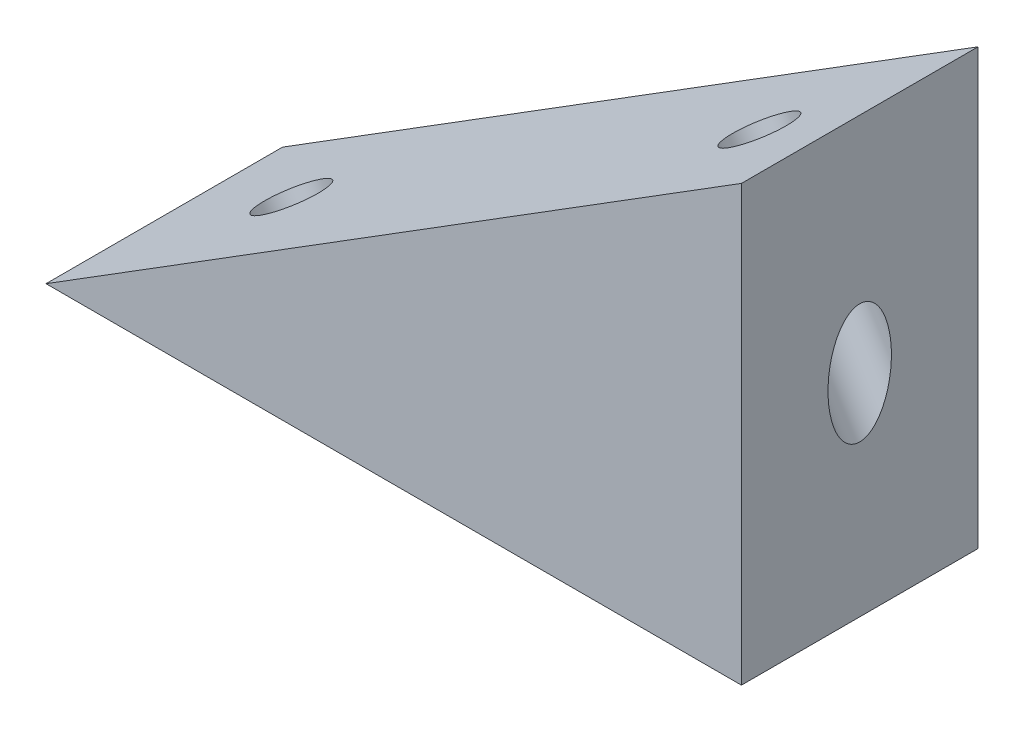
ISO-10303-21;
HEADER;
FILE_DESCRIPTION(('STEP AP214'),'2;1');
FILE_NAME('part.step','',(''),(''),'','','');
FILE_SCHEMA(('AUTOMOTIVE_DESIGN { 1 0 10303 214 1 1 1 1 }'));
ENDSEC;
DATA;
#1=APPLICATION_CONTEXT('core data for automotive mechanical design processes');
#2=APPLICATION_PROTOCOL_DEFINITION('international standard','automotive_design',2000,#1);
#3=PRODUCT_CONTEXT('',#1,'mechanical');
#4=PRODUCT('Part','Part','',(#3));
#5=PRODUCT_RELATED_PRODUCT_CATEGORY('part','',(#4));
#6=PRODUCT_DEFINITION_FORMATION('','',#4);
#7=PRODUCT_DEFINITION_CONTEXT('part definition',#1,'design');
#8=PRODUCT_DEFINITION('design','',#6,#7);
#9=PRODUCT_DEFINITION_SHAPE('','',#8);
#10=(LENGTH_UNIT() NAMED_UNIT(*) SI_UNIT(.MILLI.,.METRE.));
#11=(NAMED_UNIT(*) PLANE_ANGLE_UNIT() SI_UNIT($,.RADIAN.));
#12=(NAMED_UNIT(*) SI_UNIT($,.STERADIAN.) SOLID_ANGLE_UNIT());
#13=UNCERTAINTY_MEASURE_WITH_UNIT(LENGTH_MEASURE(1.E-05),#10,'distance_accuracy_value','');
#14=(GEOMETRIC_REPRESENTATION_CONTEXT(3) GLOBAL_UNCERTAINTY_ASSIGNED_CONTEXT((#13)) GLOBAL_UNIT_ASSIGNED_CONTEXT((#10,
#11,#12)) REPRESENTATION_CONTEXT('',''));
#15=CARTESIAN_POINT('',(0.,0.,0.));
#16=DIRECTION('',(0.,0.,1.));
#17=DIRECTION('',(1.,0.,0.));
#18=AXIS2_PLACEMENT_3D('',#15,#16,#17);
#19=CARTESIAN_POINT('',(-56.0000000140004,0.,19.05));
#20=DIRECTION('',(0.,1.,0.));
#21=DIRECTION('',(0.,0.,1.));
#22=AXIS2_PLACEMENT_3D('',#19,#20,#21);
#23=PLANE('',#22);
#24=CARTESIAN_POINT('',(-41.7802987264904,0.,9.52500000000001));
#25=DIRECTION('',(0.,1.,0.));
#26=DIRECTION('',(-1.,0.,0.));
#27=AXIS2_PLACEMENT_3D('',#24,#25,#26);
#28=ELLIPSE('',#27,3.0100887102624,2.55269999999999);
#29=CARTESIAN_POINT('',(-44.7903874367528,0.,9.52500000000001));
#30=VERTEX_POINT('',#29);
#31=EDGE_CURVE('E120',#30,#30,#28,.T.);
#32=ORIENTED_EDGE('',*,*,#31,.T.);
#33=EDGE_LOOP('',(#32));
#34=FACE_BOUND('',#33,.T.);
#35=DIRECTION('',(1.,0.,0.));
#36=VECTOR('',#35,1.);
#37=CARTESIAN_POINT('',(-56.0000000140004,0.,0.));
#38=LINE('',#37,#36);
#39=CARTESIAN_POINT('',(-56.0000000140004,0.,0.));
#40=VERTEX_POINT('',#39);
#41=CARTESIAN_POINT('',(0.,0.,0.));
#42=VERTEX_POINT('',#41);
#43=EDGE_CURVE('E86',#40,#42,#38,.T.);
#44=ORIENTED_EDGE('',*,*,#43,.T.);
#45=DIRECTION('',(0.,0.,-1.));
#46=VECTOR('',#45,1.);
#47=CARTESIAN_POINT('',(0.,0.,19.05));
#48=LINE('',#47,#46);
#49=CARTESIAN_POINT('',(0.,0.,19.05));
#50=VERTEX_POINT('',#49);
#51=EDGE_CURVE('E11',#50,#42,#48,.T.);
#52=ORIENTED_EDGE('',*,*,#51,.F.);
#53=DIRECTION('',(1.,0.,0.));
#54=VECTOR('',#53,1.);
#55=CARTESIAN_POINT('',(-56.0000000140004,0.,19.05));
#56=LINE('',#55,#54);
#57=CARTESIAN_POINT('',(-56.0000000140004,0.,19.05));
#58=VERTEX_POINT('',#57);
#59=EDGE_CURVE('E79',#58,#50,#56,.T.);
#60=ORIENTED_EDGE('',*,*,#59,.F.);
#61=DIRECTION('',(0.,0.,-1.));
#62=VECTOR('',#61,1.);
#63=CARTESIAN_POINT('',(-56.0000000140004,0.,19.05));
#64=LINE('',#63,#62);
#65=EDGE_CURVE('E87',#58,#40,#64,.T.);
#66=ORIENTED_EDGE('',*,*,#65,.T.);
#67=EDGE_LOOP('',(#44,#52,#60,#66));
#68=FACE_BOUND('',#67,.T.);
#69=ADVANCED_FACE('F39',(#34,#68),#23,.F.);
#70=CARTESIAN_POINT('',(0.,0.,19.05));
#71=DIRECTION('',(-1.,0.,0.));
#72=DIRECTION('',(0.,0.,1.));
#73=AXIS2_PLACEMENT_3D('',#70,#71,#72);
#74=PLANE('',#73);
#75=CARTESIAN_POINT('',(0.,17.0182475272011,9.525));
#76=DIRECTION('',(-1.,0.,0.));
#77=DIRECTION('',(0.,1.,0.));
#78=AXIS2_PLACEMENT_3D('',#75,#76,#77);
#79=ELLIPSE('',#78,4.81714889850965,2.55269999999999);
#80=CARTESIAN_POINT('',(0.,21.8353964257108,9.525));
#81=VERTEX_POINT('',#80);
#82=EDGE_CURVE('E89',#81,#81,#79,.T.);
#83=ORIENTED_EDGE('',*,*,#82,.T.);
#84=EDGE_LOOP('',(#83));
#85=FACE_BOUND('',#84,.T.);
#86=DIRECTION('',(0.,1.,0.));
#87=VECTOR('',#86,1.);
#88=CARTESIAN_POINT('',(0.,0.,0.));
#89=LINE('',#88,#87);
#90=CARTESIAN_POINT('',(0.,34.9926837156701,0.));
#91=VERTEX_POINT('',#90);
#92=EDGE_CURVE('E67',#42,#91,#89,.T.);
#93=ORIENTED_EDGE('',*,*,#92,.T.);
#94=DIRECTION('',(0.,0.,-1.));
#95=VECTOR('',#94,1.);
#96=CARTESIAN_POINT('',(0.,34.9926837156701,19.05));
#97=LINE('',#96,#95);
#98=CARTESIAN_POINT('',(0.,34.9926837156701,19.05));
#99=VERTEX_POINT('',#98);
#100=EDGE_CURVE('E47',#99,#91,#97,.T.);
#101=ORIENTED_EDGE('',*,*,#100,.F.);
#102=DIRECTION('',(0.,1.,0.));
#103=VECTOR('',#102,1.);
#104=CARTESIAN_POINT('',(0.,0.,19.05));
#105=LINE('',#104,#103);
#106=EDGE_CURVE('E75',#50,#99,#105,.T.);
#107=ORIENTED_EDGE('',*,*,#106,.F.);
#108=ORIENTED_EDGE('',*,*,#51,.T.);
#109=EDGE_LOOP('',(#93,#101,#107,#108));
#110=FACE_BOUND('',#109,.T.);
#111=ADVANCED_FACE('F76',(#85,#110),#74,.F.);
#112=CARTESIAN_POINT('',(0.,34.9926837156701,19.05));
#113=DIRECTION('',(0.529919264233197,-0.848048096156431,0.));
#114=DIRECTION('',(0.848048096156431,0.529919264233197,0.));
#115=AXIS2_PLACEMENT_3D('',#112,#113,#114);
#116=PLANE('',#115);
#117=CARTESIAN_POINT('',(-45.7733959900434,6.39029142868325,9.52500000000001));
#118=DIRECTION('',(-0.529919264233197,0.848048096156431,0.));
#119=DIRECTION('',(-0.848048096156431,-0.529919264233197,0.));
#120=AXIS2_PLACEMENT_3D('',#117,#118,#119);
#121=CIRCLE('',#120,2.55269999999999);
#122=CARTESIAN_POINT('',(-47.9382083651019,5.03756652287517,9.52500000000001));
#123=VERTEX_POINT('',#122);
#124=EDGE_CURVE('E122',#123,#123,#121,.T.);
#125=ORIENTED_EDGE('',*,*,#124,.F.);
#126=EDGE_LOOP('',(#125));
#127=FACE_BOUND('',#126,.T.);
#128=CARTESIAN_POINT('',(-8.07765811589001,29.9452027238489,9.525));
#129=DIRECTION('',(-0.529919264233197,0.848048096156431,0.));
#130=DIRECTION('',(-0.848048096156431,-0.529919264233197,0.));
#131=AXIS2_PLACEMENT_3D('',#128,#129,#130);
#132=CIRCLE('',#131,2.55269999999999);
#133=CARTESIAN_POINT('',(-10.2424704909485,28.5924778180408,9.525));
#134=VERTEX_POINT('',#133);
#135=EDGE_CURVE('E93',#134,#134,#132,.T.);
#136=ORIENTED_EDGE('',*,*,#135,.F.);
#137=EDGE_LOOP('',(#136));
#138=FACE_BOUND('',#137,.T.);
#139=DIRECTION('',(-0.848048096156431,-0.529919264233197,0.));
#140=VECTOR('',#139,1.);
#141=CARTESIAN_POINT('',(0.,34.9926837156701,0.));
#142=LINE('',#141,#140);
#143=EDGE_CURVE('E72',#91,#40,#142,.T.);
#144=ORIENTED_EDGE('',*,*,#143,.T.);
#145=ORIENTED_EDGE('',*,*,#65,.F.);
#146=DIRECTION('',(-0.848048096156431,-0.529919264233197,0.));
#147=VECTOR('',#146,1.);
#148=CARTESIAN_POINT('',(0.,34.9926837156701,19.05));
#149=LINE('',#148,#147);
#150=EDGE_CURVE('E55',#99,#58,#149,.T.);
#151=ORIENTED_EDGE('',*,*,#150,.F.);
#152=ORIENTED_EDGE('',*,*,#100,.T.);
#153=EDGE_LOOP('',(#144,#145,#151,#152));
#154=FACE_BOUND('',#153,.T.);
#155=ADVANCED_FACE('F98',(#127,#138,#154),#116,.F.);
#156=CARTESIAN_POINT('',(0.,0.,19.05));
#157=DIRECTION('',(0.,0.,1.));
#158=DIRECTION('',(1.,0.,0.));
#159=AXIS2_PLACEMENT_3D('',#156,#157,#158);
#160=PLANE('',#159);
#161=ORIENTED_EDGE('',*,*,#59,.T.);
#162=ORIENTED_EDGE('',*,*,#106,.T.);
#163=ORIENTED_EDGE('',*,*,#150,.T.);
#164=EDGE_LOOP('',(#161,#162,#163));
#165=FACE_BOUND('',#164,.T.);
#166=ADVANCED_FACE('F82',(#165),#160,.T.);
#167=CARTESIAN_POINT('',(0.,0.,0.));
#168=DIRECTION('',(0.,0.,1.));
#169=DIRECTION('',(1.,0.,0.));
#170=AXIS2_PLACEMENT_3D('',#167,#168,#169);
#171=PLANE('',#170);
#172=ORIENTED_EDGE('',*,*,#43,.F.);
#173=ORIENTED_EDGE('',*,*,#143,.F.);
#174=ORIENTED_EDGE('',*,*,#92,.F.);
#175=EDGE_LOOP('',(#172,#173,#174));
#176=FACE_BOUND('',#175,.T.);
#177=ADVANCED_FACE('F99',(#176),#171,.F.);
#178=CARTESIAN_POINT('',(-8.07765811589001,29.9452027238489,9.525));
#179=DIRECTION('',(-0.529919264233197,0.848048096156431,0.));
#180=DIRECTION('',(-0.848048096156431,-0.529919264233197,0.));
#181=AXIS2_PLACEMENT_3D('',#178,#179,#180);
#182=CYLINDRICAL_SURFACE('',#181,2.55269999999999);
#183=ORIENTED_EDGE('',*,*,#135,.T.);
#184=EDGE_LOOP('',(#183));
#185=FACE_BOUND('',#184,.T.);
#186=ORIENTED_EDGE('',*,*,#82,.F.);
#187=EDGE_LOOP('',(#186));
#188=FACE_BOUND('',#187,.T.);
#189=ADVANCED_FACE('F101',(#185,#188),#182,.F.);
#190=CARTESIAN_POINT('',(-45.7733959900434,6.39029142868325,9.52500000000001));
#191=DIRECTION('',(-0.529919264233197,0.848048096156431,0.));
#192=DIRECTION('',(-0.848048096156431,-0.529919264233197,0.));
#193=AXIS2_PLACEMENT_3D('',#190,#191,#192);
#194=CYLINDRICAL_SURFACE('',#193,2.55269999999999);
#195=ORIENTED_EDGE('',*,*,#124,.T.);
#196=EDGE_LOOP('',(#195));
#197=FACE_BOUND('',#196,.T.);
#198=ORIENTED_EDGE('',*,*,#31,.F.);
#199=EDGE_LOOP('',(#198));
#200=FACE_BOUND('',#199,.T.);
#201=ADVANCED_FACE('F107',(#197,#200),#194,.F.);
#202=CLOSED_SHELL('',(#69,#111,#155,#166,#177,#189,#201));
#203=MANIFOLD_SOLID_BREP('B2',#202);
#204=ADVANCED_BREP_SHAPE_REPRESENTATION('',(#18,#203),#14);
#205=SHAPE_DEFINITION_REPRESENTATION(#9,#204);
ENDSEC;
END-ISO-10303-21;
